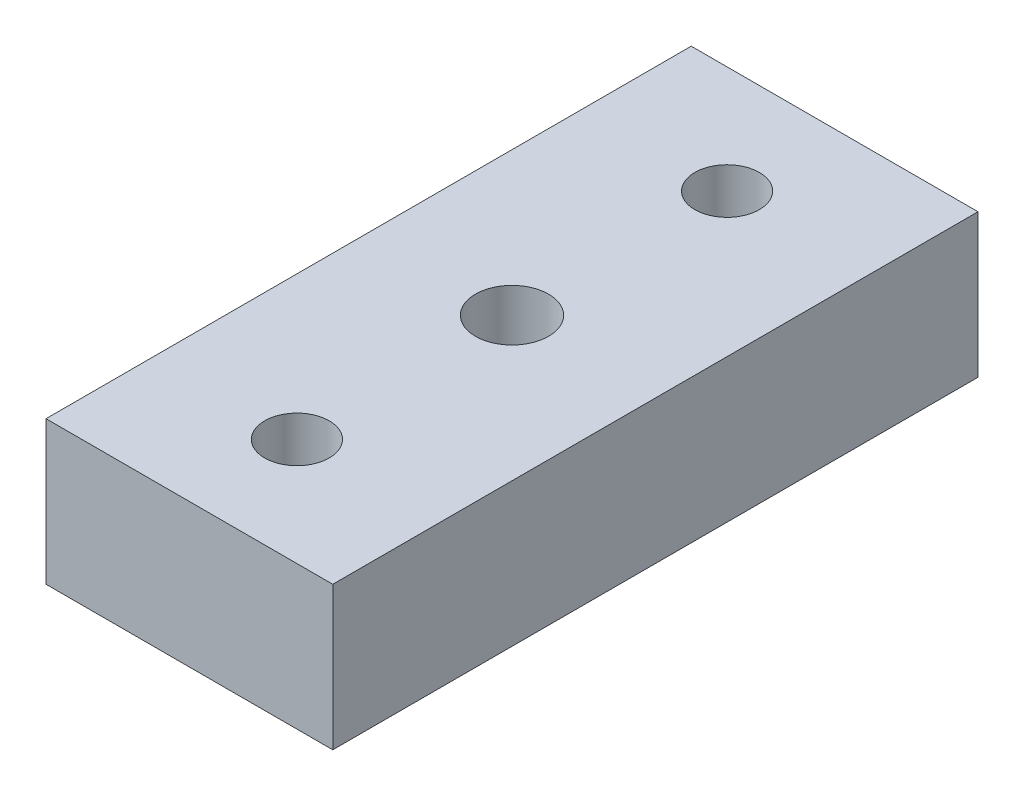
ISO-10303-21;
HEADER;
FILE_DESCRIPTION(('STEP AP214'),'2;1');
FILE_NAME('part.step','',(''),(''),'','','');
FILE_SCHEMA(('AUTOMOTIVE_DESIGN { 1 0 10303 214 1 1 1 1 }'));
ENDSEC;
DATA;
#1=APPLICATION_CONTEXT('core data for automotive mechanical design processes');
#2=APPLICATION_PROTOCOL_DEFINITION('international standard','automotive_design',2000,#1);
#3=PRODUCT_CONTEXT('',#1,'mechanical');
#4=PRODUCT('Part','Part','',(#3));
#5=PRODUCT_RELATED_PRODUCT_CATEGORY('part','',(#4));
#6=PRODUCT_DEFINITION_FORMATION('','',#4);
#7=PRODUCT_DEFINITION_CONTEXT('part definition',#1,'design');
#8=PRODUCT_DEFINITION('design','',#6,#7);
#9=PRODUCT_DEFINITION_SHAPE('','',#8);
#10=(LENGTH_UNIT() NAMED_UNIT(*) SI_UNIT(.MILLI.,.METRE.));
#11=(NAMED_UNIT(*) PLANE_ANGLE_UNIT() SI_UNIT($,.RADIAN.));
#12=(NAMED_UNIT(*) SI_UNIT($,.STERADIAN.) SOLID_ANGLE_UNIT());
#13=UNCERTAINTY_MEASURE_WITH_UNIT(LENGTH_MEASURE(1.E-05),#10,'distance_accuracy_value','');
#14=(GEOMETRIC_REPRESENTATION_CONTEXT(3) GLOBAL_UNCERTAINTY_ASSIGNED_CONTEXT((#13)) GLOBAL_UNIT_ASSIGNED_CONTEXT((#10,
#11,#12)) REPRESENTATION_CONTEXT('',''));
#15=CARTESIAN_POINT('',(0.,0.,0.));
#16=DIRECTION('',(0.,0.,1.));
#17=DIRECTION('',(1.,0.,0.));
#18=AXIS2_PLACEMENT_3D('',#15,#16,#17);
#19=CARTESIAN_POINT('',(-20.,20.,45.));
#20=DIRECTION('',(1.,0.,0.));
#21=DIRECTION('',(0.,0.,-1.));
#22=AXIS2_PLACEMENT_3D('',#19,#20,#21);
#23=PLANE('',#22);
#24=DIRECTION('',(0.,0.,1.));
#25=VECTOR('',#24,1.);
#26=CARTESIAN_POINT('',(-20.,0.,45.));
#27=LINE('',#26,#25);
#28=CARTESIAN_POINT('',(-20.,0.,-45.));
#29=VERTEX_POINT('',#28);
#30=CARTESIAN_POINT('',(-20.,0.,45.));
#31=VERTEX_POINT('',#30);
#32=EDGE_CURVE('E114',#29,#31,#27,.T.);
#33=ORIENTED_EDGE('',*,*,#32,.T.);
#34=DIRECTION('',(0.,-1.,0.));
#35=VECTOR('',#34,1.);
#36=CARTESIAN_POINT('',(-20.,20.,45.));
#37=LINE('',#36,#35);
#38=CARTESIAN_POINT('',(-20.,20.,45.));
#39=VERTEX_POINT('',#38);
#40=EDGE_CURVE('E11',#39,#31,#37,.T.);
#41=ORIENTED_EDGE('',*,*,#40,.F.);
#42=DIRECTION('',(0.,0.,1.));
#43=VECTOR('',#42,1.);
#44=CARTESIAN_POINT('',(-20.,20.,45.));
#45=LINE('',#44,#43);
#46=CARTESIAN_POINT('',(-20.,20.,-45.));
#47=VERTEX_POINT('',#46);
#48=EDGE_CURVE('E96',#47,#39,#45,.T.);
#49=ORIENTED_EDGE('',*,*,#48,.F.);
#50=DIRECTION('',(0.,-1.,0.));
#51=VECTOR('',#50,1.);
#52=CARTESIAN_POINT('',(-20.,20.,-45.));
#53=LINE('',#52,#51);
#54=EDGE_CURVE('E110',#47,#29,#53,.T.);
#55=ORIENTED_EDGE('',*,*,#54,.T.);
#56=EDGE_LOOP('',(#33,#41,#49,#55));
#57=FACE_BOUND('',#56,.T.);
#58=ADVANCED_FACE('F42',(#57),#23,.F.);
#59=CARTESIAN_POINT('',(-20.,20.,45.));
#60=DIRECTION('',(0.,0.,-1.));
#61=DIRECTION('',(-1.,0.,0.));
#62=AXIS2_PLACEMENT_3D('',#59,#60,#61);
#63=PLANE('',#62);
#64=DIRECTION('',(1.,0.,0.));
#65=VECTOR('',#64,1.);
#66=CARTESIAN_POINT('',(-20.,0.,45.));
#67=LINE('',#66,#65);
#68=CARTESIAN_POINT('',(20.,0.,45.));
#69=VERTEX_POINT('',#68);
#70=EDGE_CURVE('E101',#31,#69,#67,.T.);
#71=ORIENTED_EDGE('',*,*,#70,.T.);
#72=DIRECTION('',(0.,-1.,0.));
#73=VECTOR('',#72,1.);
#74=CARTESIAN_POINT('',(20.,20.,45.));
#75=LINE('',#74,#73);
#76=CARTESIAN_POINT('',(20.,20.,45.));
#77=VERTEX_POINT('',#76);
#78=EDGE_CURVE('E52',#77,#69,#75,.T.);
#79=ORIENTED_EDGE('',*,*,#78,.F.);
#80=DIRECTION('',(1.,0.,0.));
#81=VECTOR('',#80,1.);
#82=CARTESIAN_POINT('',(-20.,20.,45.));
#83=LINE('',#82,#81);
#84=EDGE_CURVE('E91',#39,#77,#83,.T.);
#85=ORIENTED_EDGE('',*,*,#84,.F.);
#86=ORIENTED_EDGE('',*,*,#40,.T.);
#87=EDGE_LOOP('',(#71,#79,#85,#86));
#88=FACE_BOUND('',#87,.T.);
#89=ADVANCED_FACE('F100',(#88),#63,.F.);
#90=CARTESIAN_POINT('',(20.,20.,45.));
#91=DIRECTION('',(-1.,0.,0.));
#92=DIRECTION('',(0.,0.,1.));
#93=AXIS2_PLACEMENT_3D('',#90,#91,#92);
#94=PLANE('',#93);
#95=DIRECTION('',(0.,0.,-1.));
#96=VECTOR('',#95,1.);
#97=CARTESIAN_POINT('',(20.,0.,45.));
#98=LINE('',#97,#96);
#99=CARTESIAN_POINT('',(20.,0.,-45.));
#100=VERTEX_POINT('',#99);
#101=EDGE_CURVE('E78',#69,#100,#98,.T.);
#102=ORIENTED_EDGE('',*,*,#101,.T.);
#103=DIRECTION('',(0.,-1.,0.));
#104=VECTOR('',#103,1.);
#105=CARTESIAN_POINT('',(20.,20.,-45.));
#106=LINE('',#105,#104);
#107=CARTESIAN_POINT('',(20.,20.,-45.));
#108=VERTEX_POINT('',#107);
#109=EDGE_CURVE('E103',#108,#100,#106,.T.);
#110=ORIENTED_EDGE('',*,*,#109,.F.);
#111=DIRECTION('',(0.,0.,-1.));
#112=VECTOR('',#111,1.);
#113=CARTESIAN_POINT('',(20.,20.,45.));
#114=LINE('',#113,#112);
#115=EDGE_CURVE('E94',#77,#108,#114,.T.);
#116=ORIENTED_EDGE('',*,*,#115,.F.);
#117=ORIENTED_EDGE('',*,*,#78,.T.);
#118=EDGE_LOOP('',(#102,#110,#116,#117));
#119=FACE_BOUND('',#118,.T.);
#120=ADVANCED_FACE('F105',(#119),#94,.F.);
#121=CARTESIAN_POINT('',(-20.,20.,-45.));
#122=DIRECTION('',(0.,0.,1.));
#123=DIRECTION('',(1.,0.,0.));
#124=AXIS2_PLACEMENT_3D('',#121,#122,#123);
#125=PLANE('',#124);
#126=DIRECTION('',(-1.,0.,0.));
#127=VECTOR('',#126,1.);
#128=CARTESIAN_POINT('',(-20.,0.,-45.));
#129=LINE('',#128,#127);
#130=EDGE_CURVE('E84',#100,#29,#129,.T.);
#131=ORIENTED_EDGE('',*,*,#130,.T.);
#132=ORIENTED_EDGE('',*,*,#54,.F.);
#133=DIRECTION('',(-1.,0.,0.));
#134=VECTOR('',#133,1.);
#135=CARTESIAN_POINT('',(-20.,20.,-45.));
#136=LINE('',#135,#134);
#137=EDGE_CURVE('E61',#108,#47,#136,.T.);
#138=ORIENTED_EDGE('',*,*,#137,.F.);
#139=ORIENTED_EDGE('',*,*,#109,.T.);
#140=EDGE_LOOP('',(#131,#132,#138,#139));
#141=FACE_BOUND('',#140,.T.);
#142=ADVANCED_FACE('F188',(#141),#125,.F.);
#143=CARTESIAN_POINT('',(0.,20.,0.));
#144=DIRECTION('',(0.,-1.,0.));
#145=DIRECTION('',(0.,0.,-1.));
#146=AXIS2_PLACEMENT_3D('',#143,#144,#145);
#147=PLANE('',#146);
#148=CARTESIAN_POINT('',(0.,20.,30.));
#149=DIRECTION('',(0.,1.,0.));
#150=DIRECTION('',(0.,0.,1.));
#151=AXIS2_PLACEMENT_3D('',#148,#149,#150);
#152=CIRCLE('',#151,4.5);
#153=CARTESIAN_POINT('',(0.,20.,34.5));
#154=VERTEX_POINT('',#153);
#155=EDGE_CURVE('E161',#154,#154,#152,.T.);
#156=ORIENTED_EDGE('',*,*,#155,.F.);
#157=EDGE_LOOP('',(#156));
#158=FACE_BOUND('',#157,.T.);
#159=CARTESIAN_POINT('',(0.,20.,-30.));
#160=DIRECTION('',(0.,1.,0.));
#161=DIRECTION('',(0.,0.,1.));
#162=AXIS2_PLACEMENT_3D('',#159,#160,#161);
#163=CIRCLE('',#162,4.5);
#164=CARTESIAN_POINT('',(0.,20.,-25.5));
#165=VERTEX_POINT('',#164);
#166=EDGE_CURVE('E142',#165,#165,#163,.T.);
#167=ORIENTED_EDGE('',*,*,#166,.F.);
#168=EDGE_LOOP('',(#167));
#169=FACE_BOUND('',#168,.T.);
#170=CARTESIAN_POINT('',(0.,20.,0.));
#171=DIRECTION('',(0.,1.,0.));
#172=DIRECTION('',(0.,0.,1.));
#173=AXIS2_PLACEMENT_3D('',#170,#171,#172);
#174=CIRCLE('',#173,5.1);
#175=CARTESIAN_POINT('',(0.,20.,5.1));
#176=VERTEX_POINT('',#175);
#177=EDGE_CURVE('E131',#176,#176,#174,.T.);
#178=ORIENTED_EDGE('',*,*,#177,.F.);
#179=EDGE_LOOP('',(#178));
#180=FACE_BOUND('',#179,.T.);
#181=ORIENTED_EDGE('',*,*,#48,.T.);
#182=ORIENTED_EDGE('',*,*,#84,.T.);
#183=ORIENTED_EDGE('',*,*,#115,.T.);
#184=ORIENTED_EDGE('',*,*,#137,.T.);
#185=EDGE_LOOP('',(#181,#182,#183,#184));
#186=FACE_BOUND('',#185,.T.);
#187=ADVANCED_FACE('F92',(#158,#169,#180,#186),#147,.F.);
#188=CARTESIAN_POINT('',(0.,0.,0.));
#189=DIRECTION('',(0.,-1.,0.));
#190=DIRECTION('',(0.,0.,-1.));
#191=AXIS2_PLACEMENT_3D('',#188,#189,#190);
#192=PLANE('',#191);
#193=CARTESIAN_POINT('',(0.,0.,30.));
#194=DIRECTION('',(0.,1.,0.));
#195=DIRECTION('',(0.,0.,1.));
#196=AXIS2_PLACEMENT_3D('',#193,#194,#195);
#197=CIRCLE('',#196,7.);
#198=CARTESIAN_POINT('',(0.,0.,37.));
#199=VERTEX_POINT('',#198);
#200=EDGE_CURVE('E144',#199,#199,#197,.T.);
#201=ORIENTED_EDGE('',*,*,#200,.T.);
#202=EDGE_LOOP('',(#201));
#203=FACE_BOUND('',#202,.T.);
#204=CARTESIAN_POINT('',(0.,0.,-30.));
#205=DIRECTION('',(0.,1.,0.));
#206=DIRECTION('',(0.,0.,1.));
#207=AXIS2_PLACEMENT_3D('',#204,#205,#206);
#208=CIRCLE('',#207,7.);
#209=CARTESIAN_POINT('',(0.,0.,-23.));
#210=VERTEX_POINT('',#209);
#211=EDGE_CURVE('E151',#210,#210,#208,.T.);
#212=ORIENTED_EDGE('',*,*,#211,.T.);
#213=EDGE_LOOP('',(#212));
#214=FACE_BOUND('',#213,.T.);
#215=CARTESIAN_POINT('',(0.,0.,0.));
#216=DIRECTION('',(0.,-1.,0.));
#217=DIRECTION('',(0.,0.,-1.));
#218=AXIS2_PLACEMENT_3D('',#215,#216,#217);
#219=CIRCLE('',#218,5.1);
#220=CARTESIAN_POINT('',(0.,0.,5.1));
#221=VERTEX_POINT('',#220);
#222=EDGE_CURVE('E118',#221,#221,#219,.T.);
#223=ORIENTED_EDGE('',*,*,#222,.F.);
#224=EDGE_LOOP('',(#223));
#225=FACE_BOUND('',#224,.T.);
#226=ORIENTED_EDGE('',*,*,#32,.F.);
#227=ORIENTED_EDGE('',*,*,#130,.F.);
#228=ORIENTED_EDGE('',*,*,#101,.F.);
#229=ORIENTED_EDGE('',*,*,#70,.F.);
#230=EDGE_LOOP('',(#226,#227,#228,#229));
#231=FACE_BOUND('',#230,.T.);
#232=ADVANCED_FACE('F187',(#203,#214,#225,#231),#192,.T.);
#233=CARTESIAN_POINT('',(0.,-1.2E-05,0.));
#234=DIRECTION('',(0.,1.,0.));
#235=DIRECTION('',(0.,0.,1.));
#236=AXIS2_PLACEMENT_3D('',#233,#234,#235);
#237=CYLINDRICAL_SURFACE('',#236,5.1);
#238=CARTESIAN_POINT('',(0.,0.,5.1));
#239=CARTESIAN_POINT('',(0.,0.208333333333334,5.1));
#240=CARTESIAN_POINT('',(0.,0.416666666666667,5.1));
#241=CARTESIAN_POINT('',(0.,0.833333333333333,5.1));
#242=CARTESIAN_POINT('',(0.,1.04166666666667,5.1));
#243=CARTESIAN_POINT('',(0.,1.45833333333333,5.1));
#244=CARTESIAN_POINT('',(0.,1.66666666666667,5.1));
#245=CARTESIAN_POINT('',(0.,2.08333333333333,5.1));
#246=CARTESIAN_POINT('',(0.,2.29166666666667,5.1));
#247=CARTESIAN_POINT('',(0.,2.70833333333333,5.1));
#248=CARTESIAN_POINT('',(0.,2.91666666666667,5.1));
#249=CARTESIAN_POINT('',(0.,3.33333333333333,5.1));
#250=CARTESIAN_POINT('',(0.,3.54166666666667,5.1));
#251=CARTESIAN_POINT('',(0.,3.95833333333333,5.1));
#252=CARTESIAN_POINT('',(0.,4.16666666666667,5.1));
#253=CARTESIAN_POINT('',(0.,4.58333333333333,5.1));
#254=CARTESIAN_POINT('',(0.,4.79166666666667,5.1));
#255=CARTESIAN_POINT('',(0.,5.20833333333333,5.1));
#256=CARTESIAN_POINT('',(0.,5.41666666666667,5.1));
#257=CARTESIAN_POINT('',(0.,5.83333333333333,5.1));
#258=CARTESIAN_POINT('',(0.,6.04166666666667,5.1));
#259=CARTESIAN_POINT('',(0.,6.45833333333333,5.1));
#260=CARTESIAN_POINT('',(0.,6.66666666666667,5.1));
#261=CARTESIAN_POINT('',(0.,7.08333333333333,5.1));
#262=CARTESIAN_POINT('',(0.,7.29166666666667,5.1));
#263=CARTESIAN_POINT('',(0.,7.70833333333333,5.1));
#264=CARTESIAN_POINT('',(0.,7.91666666666667,5.1));
#265=CARTESIAN_POINT('',(0.,8.33333333333333,5.1));
#266=CARTESIAN_POINT('',(0.,8.54166666666667,5.1));
#267=CARTESIAN_POINT('',(0.,8.95833333333333,5.1));
#268=CARTESIAN_POINT('',(0.,9.16666666666667,5.1));
#269=CARTESIAN_POINT('',(0.,9.58333333333333,5.1));
#270=CARTESIAN_POINT('',(0.,9.79166666666667,5.1));
#271=CARTESIAN_POINT('',(0.,10.2083333333333,5.1));
#272=CARTESIAN_POINT('',(0.,10.4166666666667,5.1));
#273=CARTESIAN_POINT('',(0.,10.8333333333333,5.1));
#274=CARTESIAN_POINT('',(0.,11.0416666666667,5.1));
#275=CARTESIAN_POINT('',(0.,11.4583333333333,5.1));
#276=CARTESIAN_POINT('',(0.,11.6666666666667,5.1));
#277=CARTESIAN_POINT('',(0.,12.0833333333333,5.1));
#278=CARTESIAN_POINT('',(0.,12.2916666666667,5.1));
#279=CARTESIAN_POINT('',(0.,12.7083333333333,5.1));
#280=CARTESIAN_POINT('',(0.,12.9166666666667,5.1));
#281=CARTESIAN_POINT('',(0.,13.3333333333333,5.1));
#282=CARTESIAN_POINT('',(0.,13.5416666666667,5.1));
#283=CARTESIAN_POINT('',(0.,13.9583333333333,5.1));
#284=CARTESIAN_POINT('',(0.,14.1666666666667,5.1));
#285=CARTESIAN_POINT('',(0.,14.5833333333333,5.1));
#286=CARTESIAN_POINT('',(0.,14.7916666666667,5.1));
#287=CARTESIAN_POINT('',(0.,15.2083333333333,5.1));
#288=CARTESIAN_POINT('',(0.,15.4166666666667,5.1));
#289=CARTESIAN_POINT('',(0.,15.8333333333333,5.1));
#290=CARTESIAN_POINT('',(0.,16.0416666666667,5.1));
#291=CARTESIAN_POINT('',(0.,16.4583333333333,5.1));
#292=CARTESIAN_POINT('',(0.,16.6666666666667,5.1));
#293=CARTESIAN_POINT('',(0.,17.0833333333333,5.1));
#294=CARTESIAN_POINT('',(0.,17.2916666666667,5.1));
#295=CARTESIAN_POINT('',(0.,17.7083333333333,5.1));
#296=CARTESIAN_POINT('',(0.,17.9166666666667,5.1));
#297=CARTESIAN_POINT('',(0.,18.3333333333333,5.1));
#298=CARTESIAN_POINT('',(0.,18.5416666666667,5.1));
#299=CARTESIAN_POINT('',(0.,18.9583333333333,5.1));
#300=CARTESIAN_POINT('',(0.,19.1666666666667,5.1));
#301=CARTESIAN_POINT('',(0.,19.5833333333333,5.1));
#302=CARTESIAN_POINT('',(0.,19.7916666666667,5.1));
#303=CARTESIAN_POINT('',(0.,20.,5.1));
#304=B_SPLINE_CURVE_WITH_KNOTS('',3,(#238,#239,#240,#241,#242,#243,#244,#245,#246,#247,#248,
#249,#250,#251,#252,#253,#254,#255,#256,#257,#258,#259,#260,#261,#262,#263,#264,#265,#266,#267,
#268,#269,#270,#271,#272,#273,#274,#275,#276,#277,#278,#279,#280,#281,#282,#283,#284,#285,#286,
#287,#288,#289,#290,#291,#292,#293,#294,#295,#296,#297,#298,#299,#300,#301,#302,#303),
.UNSPECIFIED.,.F.,.F.,(4,2,2,2,2,2,2,2,2,2,2,2,2,2,2,2,2,2,2,2,2,2,2,2,2,2,2,2,2,2,2,2,4),(0.,
0.625,1.25,1.875,2.5,3.125,3.75,4.375,5.,5.625,6.25,6.875,7.5,8.125,8.75,9.375,10.,10.625,11.25,
11.875,12.5,13.125,13.75,14.375,15.,15.625,16.25,16.875,17.5,18.125,18.75,19.375,20.),.UNSPECIFIED.);
#305=EDGE_CURVE('BSEAM184',#221,#176,#304,.T.);
#306=ORIENTED_EDGE('',*,*,#222,.T.);
#307=ORIENTED_EDGE('',*,*,#177,.T.);
#308=ORIENTED_EDGE('',*,*,#305,.T.);
#309=ORIENTED_EDGE('',*,*,#305,.F.);
#310=EDGE_LOOP('',(#306,#308,#307,#309));
#311=FACE_BOUND('',#310,.T.);
#312=ADVANCED_FACE('F184',(#311),#237,.F.);
#313=CARTESIAN_POINT('',(0.,-1.2E-05,-30.));
#314=DIRECTION('',(0.,1.,0.));
#315=DIRECTION('',(0.,0.,1.));
#316=AXIS2_PLACEMENT_3D('',#313,#314,#315);
#317=CYLINDRICAL_SURFACE('',#316,4.5);
#318=CARTESIAN_POINT('',(0.,9.,-30.));
#319=DIRECTION('',(0.,1.,0.));
#320=DIRECTION('',(0.,0.,1.));
#321=AXIS2_PLACEMENT_3D('',#318,#319,#320);
#322=CIRCLE('',#321,4.5);
#323=CARTESIAN_POINT('',(0.,9.,-25.5));
#324=VERTEX_POINT('',#323);
#325=EDGE_CURVE('E45',#324,#324,#322,.F.);
#326=CARTESIAN_POINT('',(0.,9.,-25.5));
#327=CARTESIAN_POINT('',(0.,9.11458333333333,-25.5));
#328=CARTESIAN_POINT('',(0.,9.22916666666667,-25.5));
#329=CARTESIAN_POINT('',(0.,9.45833333333333,-25.5));
#330=CARTESIAN_POINT('',(0.,9.57291666666667,-25.5));
#331=CARTESIAN_POINT('',(0.,9.80208333333333,-25.5));
#332=CARTESIAN_POINT('',(0.,9.91666666666667,-25.5));
#333=CARTESIAN_POINT('',(0.,10.1458333333333,-25.5));
#334=CARTESIAN_POINT('',(0.,10.2604166666667,-25.5));
#335=CARTESIAN_POINT('',(0.,10.4895833333333,-25.5));
#336=CARTESIAN_POINT('',(0.,10.6041666666667,-25.5));
#337=CARTESIAN_POINT('',(0.,10.8333333333333,-25.5));
#338=CARTESIAN_POINT('',(0.,10.9479166666667,-25.5));
#339=CARTESIAN_POINT('',(0.,11.1770833333333,-25.5));
#340=CARTESIAN_POINT('',(0.,11.2916666666667,-25.5));
#341=CARTESIAN_POINT('',(0.,11.5208333333333,-25.5));
#342=CARTESIAN_POINT('',(0.,11.6354166666667,-25.5));
#343=CARTESIAN_POINT('',(0.,11.8645833333333,-25.5));
#344=CARTESIAN_POINT('',(0.,11.9791666666667,-25.5));
#345=CARTESIAN_POINT('',(0.,12.2083333333333,-25.5));
#346=CARTESIAN_POINT('',(0.,12.3229166666667,-25.5));
#347=CARTESIAN_POINT('',(0.,12.5520833333333,-25.5));
#348=CARTESIAN_POINT('',(0.,12.6666666666667,-25.5));
#349=CARTESIAN_POINT('',(0.,12.8958333333333,-25.5));
#350=CARTESIAN_POINT('',(0.,13.0104166666667,-25.5));
#351=CARTESIAN_POINT('',(0.,13.2395833333333,-25.5));
#352=CARTESIAN_POINT('',(0.,13.3541666666667,-25.5));
#353=CARTESIAN_POINT('',(0.,13.5833333333333,-25.5));
#354=CARTESIAN_POINT('',(0.,13.6979166666667,-25.5));
#355=CARTESIAN_POINT('',(0.,13.9270833333333,-25.5));
#356=CARTESIAN_POINT('',(0.,14.0416666666667,-25.5));
#357=CARTESIAN_POINT('',(0.,14.2708333333333,-25.5));
#358=CARTESIAN_POINT('',(0.,14.3854166666667,-25.5));
#359=CARTESIAN_POINT('',(0.,14.6145833333333,-25.5));
#360=CARTESIAN_POINT('',(0.,14.7291666666667,-25.5));
#361=CARTESIAN_POINT('',(0.,14.9583333333333,-25.5));
#362=CARTESIAN_POINT('',(0.,15.0729166666667,-25.5));
#363=CARTESIAN_POINT('',(0.,15.3020833333333,-25.5));
#364=CARTESIAN_POINT('',(0.,15.4166666666667,-25.5));
#365=CARTESIAN_POINT('',(0.,15.6458333333333,-25.5));
#366=CARTESIAN_POINT('',(0.,15.7604166666667,-25.5));
#367=CARTESIAN_POINT('',(0.,15.9895833333333,-25.5));
#368=CARTESIAN_POINT('',(0.,16.1041666666667,-25.5));
#369=CARTESIAN_POINT('',(0.,16.3333333333333,-25.5));
#370=CARTESIAN_POINT('',(0.,16.4479166666667,-25.5));
#371=CARTESIAN_POINT('',(0.,16.6770833333333,-25.5));
#372=CARTESIAN_POINT('',(0.,16.7916666666667,-25.5));
#373=CARTESIAN_POINT('',(0.,17.0208333333333,-25.5));
#374=CARTESIAN_POINT('',(0.,17.1354166666667,-25.5));
#375=CARTESIAN_POINT('',(0.,17.3645833333333,-25.5));
#376=CARTESIAN_POINT('',(0.,17.4791666666667,-25.5));
#377=CARTESIAN_POINT('',(0.,17.7083333333333,-25.5));
#378=CARTESIAN_POINT('',(0.,17.8229166666667,-25.5));
#379=CARTESIAN_POINT('',(0.,18.0520833333333,-25.5));
#380=CARTESIAN_POINT('',(0.,18.1666666666667,-25.5));
#381=CARTESIAN_POINT('',(0.,18.3958333333333,-25.5));
#382=CARTESIAN_POINT('',(0.,18.5104166666667,-25.5));
#383=CARTESIAN_POINT('',(0.,18.7395833333333,-25.5));
#384=CARTESIAN_POINT('',(0.,18.8541666666667,-25.5));
#385=CARTESIAN_POINT('',(0.,19.0833333333333,-25.5));
#386=CARTESIAN_POINT('',(0.,19.1979166666667,-25.5));
#387=CARTESIAN_POINT('',(0.,19.4270833333333,-25.5));
#388=CARTESIAN_POINT('',(0.,19.5416666666667,-25.5));
#389=CARTESIAN_POINT('',(0.,19.7708333333333,-25.5));
#390=CARTESIAN_POINT('',(0.,19.8854166666667,-25.5));
#391=CARTESIAN_POINT('',(0.,20.,-25.5));
#392=B_SPLINE_CURVE_WITH_KNOTS('',3,(#326,#327,#328,#329,#330,#331,#332,#333,#334,#335,#336,
#337,#338,#339,#340,#341,#342,#343,#344,#345,#346,#347,#348,#349,#350,#351,#352,#353,#354,#355,
#356,#357,#358,#359,#360,#361,#362,#363,#364,#365,#366,#367,#368,#369,#370,#371,#372,#373,#374,
#375,#376,#377,#378,#379,#380,#381,#382,#383,#384,#385,#386,#387,#388,#389,#390,#391),
.UNSPECIFIED.,.F.,.F.,(4,2,2,2,2,2,2,2,2,2,2,2,2,2,2,2,2,2,2,2,2,2,2,2,2,2,2,2,2,2,2,2,4),(0.,
0.34375,0.687500000000001,1.03125,1.375,1.71875,2.0625,2.40625,2.75,3.09375,3.4375,3.78125,
4.125,4.46875,4.8125,5.15625,5.5,5.84375,6.1875,6.53125,6.875,7.21875,7.5625,7.90625,8.25,
8.59375,8.9375,9.28125,9.625,9.96875,10.3125,10.65625,11.),.UNSPECIFIED.);
#393=EDGE_CURVE('BSEAM225',#324,#165,#392,.T.);
#394=ORIENTED_EDGE('',*,*,#325,.T.);
#395=ORIENTED_EDGE('',*,*,#166,.T.);
#396=ORIENTED_EDGE('',*,*,#393,.T.);
#397=ORIENTED_EDGE('',*,*,#393,.F.);
#398=EDGE_LOOP('',(#394,#396,#395,#397));
#399=FACE_BOUND('',#398,.T.);
#400=ADVANCED_FACE('F225',(#399),#317,.F.);
#401=CARTESIAN_POINT('',(0.,-1.2E-05,30.));
#402=DIRECTION('',(0.,1.,0.));
#403=DIRECTION('',(0.,0.,1.));
#404=AXIS2_PLACEMENT_3D('',#401,#402,#403);
#405=CYLINDRICAL_SURFACE('',#404,4.5);
#406=CARTESIAN_POINT('',(0.,9.,30.));
#407=DIRECTION('',(0.,1.,0.));
#408=DIRECTION('',(0.,0.,1.));
#409=AXIS2_PLACEMENT_3D('',#406,#407,#408);
#410=CIRCLE('',#409,4.5);
#411=CARTESIAN_POINT('',(0.,9.,34.5));
#412=VERTEX_POINT('',#411);
#413=EDGE_CURVE('E132',#412,#412,#410,.F.);
#414=CARTESIAN_POINT('',(0.,9.,34.5));
#415=CARTESIAN_POINT('',(0.,9.11458333333333,34.5));
#416=CARTESIAN_POINT('',(0.,9.22916666666667,34.5));
#417=CARTESIAN_POINT('',(0.,9.45833333333333,34.5));
#418=CARTESIAN_POINT('',(0.,9.57291666666667,34.5));
#419=CARTESIAN_POINT('',(0.,9.80208333333333,34.5));
#420=CARTESIAN_POINT('',(0.,9.91666666666667,34.5));
#421=CARTESIAN_POINT('',(0.,10.1458333333333,34.5));
#422=CARTESIAN_POINT('',(0.,10.2604166666667,34.5));
#423=CARTESIAN_POINT('',(0.,10.4895833333333,34.5));
#424=CARTESIAN_POINT('',(0.,10.6041666666667,34.5));
#425=CARTESIAN_POINT('',(0.,10.8333333333333,34.5));
#426=CARTESIAN_POINT('',(0.,10.9479166666667,34.5));
#427=CARTESIAN_POINT('',(0.,11.1770833333333,34.5));
#428=CARTESIAN_POINT('',(0.,11.2916666666667,34.5));
#429=CARTESIAN_POINT('',(0.,11.5208333333333,34.5));
#430=CARTESIAN_POINT('',(0.,11.6354166666667,34.5));
#431=CARTESIAN_POINT('',(0.,11.8645833333333,34.5));
#432=CARTESIAN_POINT('',(0.,11.9791666666667,34.5));
#433=CARTESIAN_POINT('',(0.,12.2083333333333,34.5));
#434=CARTESIAN_POINT('',(0.,12.3229166666667,34.5));
#435=CARTESIAN_POINT('',(0.,12.5520833333333,34.5));
#436=CARTESIAN_POINT('',(0.,12.6666666666667,34.5));
#437=CARTESIAN_POINT('',(0.,12.8958333333333,34.5));
#438=CARTESIAN_POINT('',(0.,13.0104166666667,34.5));
#439=CARTESIAN_POINT('',(0.,13.2395833333333,34.5));
#440=CARTESIAN_POINT('',(0.,13.3541666666667,34.5));
#441=CARTESIAN_POINT('',(0.,13.5833333333333,34.5));
#442=CARTESIAN_POINT('',(0.,13.6979166666667,34.5));
#443=CARTESIAN_POINT('',(0.,13.9270833333333,34.5));
#444=CARTESIAN_POINT('',(0.,14.0416666666667,34.5));
#445=CARTESIAN_POINT('',(0.,14.2708333333333,34.5));
#446=CARTESIAN_POINT('',(0.,14.3854166666667,34.5));
#447=CARTESIAN_POINT('',(0.,14.6145833333333,34.5));
#448=CARTESIAN_POINT('',(0.,14.7291666666667,34.5));
#449=CARTESIAN_POINT('',(0.,14.9583333333333,34.5));
#450=CARTESIAN_POINT('',(0.,15.0729166666667,34.5));
#451=CARTESIAN_POINT('',(0.,15.3020833333333,34.5));
#452=CARTESIAN_POINT('',(0.,15.4166666666667,34.5));
#453=CARTESIAN_POINT('',(0.,15.6458333333333,34.5));
#454=CARTESIAN_POINT('',(0.,15.7604166666667,34.5));
#455=CARTESIAN_POINT('',(0.,15.9895833333333,34.5));
#456=CARTESIAN_POINT('',(0.,16.1041666666667,34.5));
#457=CARTESIAN_POINT('',(0.,16.3333333333333,34.5));
#458=CARTESIAN_POINT('',(0.,16.4479166666667,34.5));
#459=CARTESIAN_POINT('',(0.,16.6770833333333,34.5));
#460=CARTESIAN_POINT('',(0.,16.7916666666667,34.5));
#461=CARTESIAN_POINT('',(0.,17.0208333333333,34.5));
#462=CARTESIAN_POINT('',(0.,17.1354166666667,34.5));
#463=CARTESIAN_POINT('',(0.,17.3645833333333,34.5));
#464=CARTESIAN_POINT('',(0.,17.4791666666667,34.5));
#465=CARTESIAN_POINT('',(0.,17.7083333333333,34.5));
#466=CARTESIAN_POINT('',(0.,17.8229166666667,34.5));
#467=CARTESIAN_POINT('',(0.,18.0520833333333,34.5));
#468=CARTESIAN_POINT('',(0.,18.1666666666667,34.5));
#469=CARTESIAN_POINT('',(0.,18.3958333333333,34.5));
#470=CARTESIAN_POINT('',(0.,18.5104166666667,34.5));
#471=CARTESIAN_POINT('',(0.,18.7395833333333,34.5));
#472=CARTESIAN_POINT('',(0.,18.8541666666667,34.5));
#473=CARTESIAN_POINT('',(0.,19.0833333333333,34.5));
#474=CARTESIAN_POINT('',(0.,19.1979166666667,34.5));
#475=CARTESIAN_POINT('',(0.,19.4270833333333,34.5));
#476=CARTESIAN_POINT('',(0.,19.5416666666667,34.5));
#477=CARTESIAN_POINT('',(0.,19.7708333333333,34.5));
#478=CARTESIAN_POINT('',(0.,19.8854166666667,34.5));
#479=CARTESIAN_POINT('',(0.,20.,34.5));
#480=B_SPLINE_CURVE_WITH_KNOTS('',3,(#414,#415,#416,#417,#418,#419,#420,#421,#422,#423,#424,
#425,#426,#427,#428,#429,#430,#431,#432,#433,#434,#435,#436,#437,#438,#439,#440,#441,#442,#443,
#444,#445,#446,#447,#448,#449,#450,#451,#452,#453,#454,#455,#456,#457,#458,#459,#460,#461,#462,
#463,#464,#465,#466,#467,#468,#469,#470,#471,#472,#473,#474,#475,#476,#477,#478,#479),
.UNSPECIFIED.,.F.,.F.,(4,2,2,2,2,2,2,2,2,2,2,2,2,2,2,2,2,2,2,2,2,2,2,2,2,2,2,2,2,2,2,2,4),(0.,
0.34375,0.687500000000001,1.03125,1.375,1.71875,2.0625,2.40625,2.75,3.09375,3.4375,3.78125,
4.125,4.46875,4.8125,5.15625,5.5,5.84375,6.1875,6.53125,6.875,7.21875,7.5625,7.90625,8.25,
8.59375,8.9375,9.28125,9.625,9.96875,10.3125,10.65625,11.),.UNSPECIFIED.);
#481=EDGE_CURVE('BSEAM241',#412,#154,#480,.T.);
#482=ORIENTED_EDGE('',*,*,#413,.T.);
#483=ORIENTED_EDGE('',*,*,#155,.T.);
#484=ORIENTED_EDGE('',*,*,#481,.T.);
#485=ORIENTED_EDGE('',*,*,#481,.F.);
#486=EDGE_LOOP('',(#482,#484,#483,#485));
#487=FACE_BOUND('',#486,.T.);
#488=ADVANCED_FACE('F241',(#487),#405,.F.);
#489=CARTESIAN_POINT('',(0.,9.,30.));
#490=DIRECTION('',(0.,1.,0.));
#491=DIRECTION('',(0.,0.,1.));
#492=AXIS2_PLACEMENT_3D('',#489,#490,#491);
#493=PLANE('',#492);
#494=CARTESIAN_POINT('',(0.,9.,30.));
#495=DIRECTION('',(0.,1.,0.));
#496=DIRECTION('',(0.,0.,1.));
#497=AXIS2_PLACEMENT_3D('',#494,#495,#496);
#498=CIRCLE('',#497,7.);
#499=CARTESIAN_POINT('',(0.,9.,37.));
#500=VERTEX_POINT('',#499);
#501=EDGE_CURVE('E135',#500,#500,#498,.T.);
#502=ORIENTED_EDGE('',*,*,#501,.F.);
#503=EDGE_LOOP('',(#502));
#504=FACE_BOUND('',#503,.T.);
#505=ORIENTED_EDGE('',*,*,#413,.F.);
#506=EDGE_LOOP('',(#505));
#507=FACE_BOUND('',#506,.T.);
#508=ADVANCED_FACE('F251',(#504,#507),#493,.F.);
#509=CARTESIAN_POINT('',(0.,9.,30.));
#510=DIRECTION('',(0.,-1.,0.));
#511=DIRECTION('',(0.,0.,-1.));
#512=AXIS2_PLACEMENT_3D('',#509,#510,#511);
#513=CYLINDRICAL_SURFACE('',#512,7.);
#514=ORIENTED_EDGE('',*,*,#501,.T.);
#515=EDGE_LOOP('',(#514));
#516=FACE_BOUND('',#515,.T.);
#517=ORIENTED_EDGE('',*,*,#200,.F.);
#518=EDGE_LOOP('',(#517));
#519=FACE_BOUND('',#518,.T.);
#520=ADVANCED_FACE('F260',(#516,#519),#513,.F.);
#521=CARTESIAN_POINT('',(0.,9.,-30.));
#522=DIRECTION('',(0.,1.,0.));
#523=DIRECTION('',(0.,0.,1.));
#524=AXIS2_PLACEMENT_3D('',#521,#522,#523);
#525=PLANE('',#524);
#526=CARTESIAN_POINT('',(0.,9.,-30.));
#527=DIRECTION('',(0.,1.,0.));
#528=DIRECTION('',(0.,0.,1.));
#529=AXIS2_PLACEMENT_3D('',#526,#527,#528);
#530=CIRCLE('',#529,7.);
#531=CARTESIAN_POINT('',(0.,9.,-23.));
#532=VERTEX_POINT('',#531);
#533=EDGE_CURVE('E157',#532,#532,#530,.T.);
#534=ORIENTED_EDGE('',*,*,#533,.F.);
#535=EDGE_LOOP('',(#534));
#536=FACE_BOUND('',#535,.T.);
#537=ORIENTED_EDGE('',*,*,#325,.F.);
#538=EDGE_LOOP('',(#537));
#539=FACE_BOUND('',#538,.T.);
#540=ADVANCED_FACE('F270',(#536,#539),#525,.F.);
#541=CARTESIAN_POINT('',(0.,9.,-30.));
#542=DIRECTION('',(0.,-1.,0.));
#543=DIRECTION('',(0.,0.,-1.));
#544=AXIS2_PLACEMENT_3D('',#541,#542,#543);
#545=CYLINDRICAL_SURFACE('',#544,7.);
#546=ORIENTED_EDGE('',*,*,#533,.T.);
#547=EDGE_LOOP('',(#546));
#548=FACE_BOUND('',#547,.T.);
#549=ORIENTED_EDGE('',*,*,#211,.F.);
#550=EDGE_LOOP('',(#549));
#551=FACE_BOUND('',#550,.T.);
#552=ADVANCED_FACE('F279',(#548,#551),#545,.F.);
#553=CLOSED_SHELL('',(#58,#89,#120,#142,#187,#232,#312,#400,#488,#508,#520,#540,#552));
#554=MANIFOLD_SOLID_BREP('B2',#553);
#555=ADVANCED_BREP_SHAPE_REPRESENTATION('',(#18,#554),#14);
#556=SHAPE_DEFINITION_REPRESENTATION(#9,#555);
ENDSEC;
END-ISO-10303-21;
